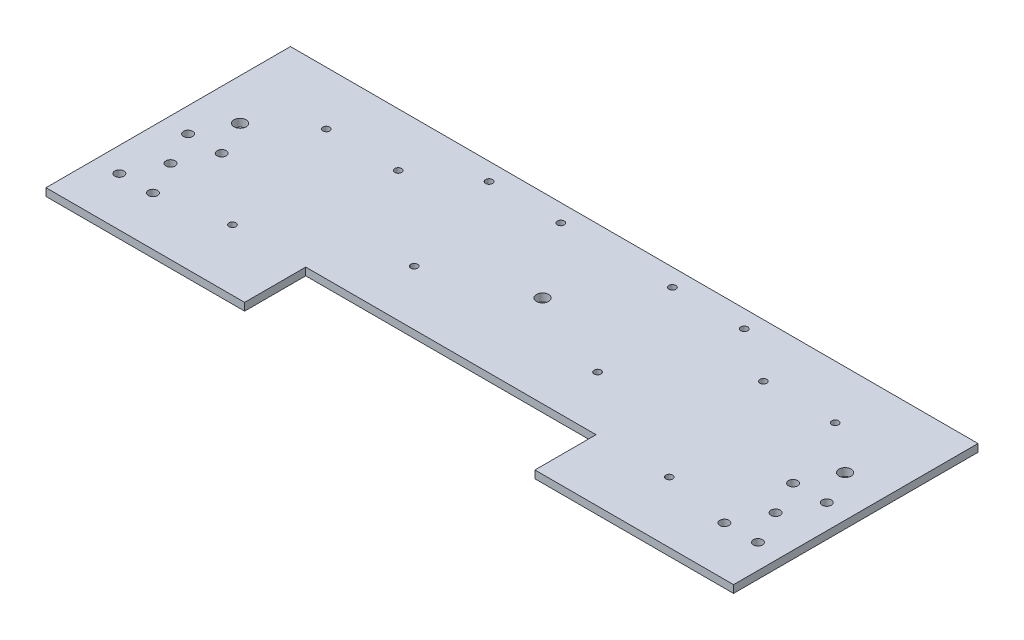
ISO-10303-21;
HEADER;
FILE_DESCRIPTION(('STEP AP214'),'2;1');
FILE_NAME('part.step','',(''),(''),'','','');
FILE_SCHEMA(('AUTOMOTIVE_DESIGN { 1 0 10303 214 1 1 1 1 }'));
ENDSEC;
DATA;
#1=APPLICATION_CONTEXT('core data for automotive mechanical design processes');
#2=APPLICATION_PROTOCOL_DEFINITION('international standard','automotive_design',2000,#1);
#3=PRODUCT_CONTEXT('',#1,'mechanical');
#4=PRODUCT('Part','Part','',(#3));
#5=PRODUCT_RELATED_PRODUCT_CATEGORY('part','',(#4));
#6=PRODUCT_DEFINITION_FORMATION('','',#4);
#7=PRODUCT_DEFINITION_CONTEXT('part definition',#1,'design');
#8=PRODUCT_DEFINITION('design','',#6,#7);
#9=PRODUCT_DEFINITION_SHAPE('','',#8);
#10=(LENGTH_UNIT() NAMED_UNIT(*) SI_UNIT(.MILLI.,.METRE.));
#11=(NAMED_UNIT(*) PLANE_ANGLE_UNIT() SI_UNIT($,.RADIAN.));
#12=(NAMED_UNIT(*) SI_UNIT($,.STERADIAN.) SOLID_ANGLE_UNIT());
#13=UNCERTAINTY_MEASURE_WITH_UNIT(LENGTH_MEASURE(1.E-05),#10,'distance_accuracy_value','');
#14=(GEOMETRIC_REPRESENTATION_CONTEXT(3) GLOBAL_UNCERTAINTY_ASSIGNED_CONTEXT((#13)) GLOBAL_UNIT_ASSIGNED_CONTEXT((#10,
#11,#12)) REPRESENTATION_CONTEXT('',''));
#15=CARTESIAN_POINT('',(0.,0.,0.));
#16=DIRECTION('',(0.,0.,1.));
#17=DIRECTION('',(1.,0.,0.));
#18=AXIS2_PLACEMENT_3D('',#15,#16,#17);
#19=CARTESIAN_POINT('',(0.,5.,0.));
#20=DIRECTION('',(0.,0.,-1.));
#21=DIRECTION('',(-1.,0.,0.));
#22=AXIS2_PLACEMENT_3D('',#19,#20,#21);
#23=PLANE('',#22);
#24=DIRECTION('',(1.,0.,0.));
#25=VECTOR('',#24,1.);
#26=CARTESIAN_POINT('',(0.,0.,0.));
#27=LINE('',#26,#25);
#28=CARTESIAN_POINT('',(130.,0.,0.));
#29=VERTEX_POINT('',#28);
#30=CARTESIAN_POINT('',(320.,0.,0.));
#31=VERTEX_POINT('',#30);
#32=EDGE_CURVE('E56',#29,#31,#27,.T.);
#33=ORIENTED_EDGE('',*,*,#32,.T.);
#34=DIRECTION('',(0.,1.,0.));
#35=VECTOR('',#34,1.);
#36=CARTESIAN_POINT('',(320.,0.,0.));
#37=LINE('',#36,#35);
#38=CARTESIAN_POINT('',(320.,5.,0.));
#39=VERTEX_POINT('',#38);
#40=EDGE_CURVE('E51',#31,#39,#37,.T.);
#41=ORIENTED_EDGE('',*,*,#40,.T.);
#42=DIRECTION('',(1.,0.,0.));
#43=VECTOR('',#42,1.);
#44=CARTESIAN_POINT('',(0.,5.,0.));
#45=LINE('',#44,#43);
#46=CARTESIAN_POINT('',(130.,5.,0.));
#47=VERTEX_POINT('',#46);
#48=EDGE_CURVE('E151',#47,#39,#45,.T.);
#49=ORIENTED_EDGE('',*,*,#48,.F.);
#50=DIRECTION('',(0.,1.,0.));
#51=VECTOR('',#50,1.);
#52=CARTESIAN_POINT('',(130.,0.,0.));
#53=LINE('',#52,#51);
#54=EDGE_CURVE('E146',#29,#47,#53,.T.);
#55=ORIENTED_EDGE('',*,*,#54,.F.);
#56=EDGE_LOOP('',(#33,#41,#49,#55));
#57=FACE_BOUND('',#56,.T.);
#58=ADVANCED_FACE('F34',(#57),#23,.F.);
#59=CARTESIAN_POINT('',(0.,5.,0.));
#60=DIRECTION('',(1.,0.,0.));
#61=DIRECTION('',(0.,0.,-1.));
#62=AXIS2_PLACEMENT_3D('',#59,#60,#61);
#63=PLANE('',#62);
#64=DIRECTION('',(0.,0.,1.));
#65=VECTOR('',#64,1.);
#66=CARTESIAN_POINT('',(0.,0.,0.));
#67=LINE('',#66,#65);
#68=CARTESIAN_POINT('',(0.,0.,-120.));
#69=VERTEX_POINT('',#68);
#70=CARTESIAN_POINT('',(0.,0.,40.));
#71=VERTEX_POINT('',#70);
#72=EDGE_CURVE('E313',#69,#71,#67,.T.);
#73=ORIENTED_EDGE('',*,*,#72,.T.);
#74=DIRECTION('',(0.,1.,0.));
#75=VECTOR('',#74,1.);
#76=CARTESIAN_POINT('',(0.,0.,40.));
#77=LINE('',#76,#75);
#78=CARTESIAN_POINT('',(0.,5.,40.));
#79=VERTEX_POINT('',#78);
#80=EDGE_CURVE('E160',#71,#79,#77,.T.);
#81=ORIENTED_EDGE('',*,*,#80,.T.);
#82=DIRECTION('',(0.,0.,1.));
#83=VECTOR('',#82,1.);
#84=CARTESIAN_POINT('',(0.,5.,0.));
#85=LINE('',#84,#83);
#86=CARTESIAN_POINT('',(0.,5.,-120.));
#87=VERTEX_POINT('',#86);
#88=EDGE_CURVE('E302',#87,#79,#85,.T.);
#89=ORIENTED_EDGE('',*,*,#88,.F.);
#90=DIRECTION('',(0.,-1.,0.));
#91=VECTOR('',#90,1.);
#92=CARTESIAN_POINT('',(0.,5.,-120.));
#93=LINE('',#92,#91);
#94=EDGE_CURVE('E43',#87,#69,#93,.T.);
#95=ORIENTED_EDGE('',*,*,#94,.T.);
#96=EDGE_LOOP('',(#73,#81,#89,#95));
#97=FACE_BOUND('',#96,.T.);
#98=ADVANCED_FACE('F36',(#97),#63,.F.);
#99=CARTESIAN_POINT('',(450.,5.,0.));
#100=DIRECTION('',(-1.,0.,0.));
#101=DIRECTION('',(0.,0.,1.));
#102=AXIS2_PLACEMENT_3D('',#99,#100,#101);
#103=PLANE('',#102);
#104=DIRECTION('',(0.,0.,-1.));
#105=VECTOR('',#104,1.);
#106=CARTESIAN_POINT('',(450.,0.,0.));
#107=LINE('',#106,#105);
#108=CARTESIAN_POINT('',(450.,0.,40.));
#109=VERTEX_POINT('',#108);
#110=CARTESIAN_POINT('',(450.,0.,-120.));
#111=VERTEX_POINT('',#110);
#112=EDGE_CURVE('E118',#109,#111,#107,.T.);
#113=ORIENTED_EDGE('',*,*,#112,.T.);
#114=DIRECTION('',(0.,-1.,0.));
#115=VECTOR('',#114,1.);
#116=CARTESIAN_POINT('',(450.,5.,-120.));
#117=LINE('',#116,#115);
#118=CARTESIAN_POINT('',(450.,5.,-120.));
#119=VERTEX_POINT('',#118);
#120=EDGE_CURVE('E11',#119,#111,#117,.T.);
#121=ORIENTED_EDGE('',*,*,#120,.F.);
#122=DIRECTION('',(0.,0.,-1.));
#123=VECTOR('',#122,1.);
#124=CARTESIAN_POINT('',(450.,5.,0.));
#125=LINE('',#124,#123);
#126=CARTESIAN_POINT('',(450.,5.,40.));
#127=VERTEX_POINT('',#126);
#128=EDGE_CURVE('E321',#127,#119,#125,.T.);
#129=ORIENTED_EDGE('',*,*,#128,.F.);
#130=DIRECTION('',(0.,1.,0.));
#131=VECTOR('',#130,1.);
#132=CARTESIAN_POINT('',(450.,0.,40.));
#133=LINE('',#132,#131);
#134=EDGE_CURVE('E110',#109,#127,#133,.T.);
#135=ORIENTED_EDGE('',*,*,#134,.F.);
#136=EDGE_LOOP('',(#113,#121,#129,#135));
#137=FACE_BOUND('',#136,.T.);
#138=ADVANCED_FACE('F335',(#137),#103,.F.);
#139=CARTESIAN_POINT('',(0.,5.,-120.));
#140=DIRECTION('',(0.,0.,1.));
#141=DIRECTION('',(1.,0.,0.));
#142=AXIS2_PLACEMENT_3D('',#139,#140,#141);
#143=PLANE('',#142);
#144=DIRECTION('',(-1.,0.,0.));
#145=VECTOR('',#144,1.);
#146=CARTESIAN_POINT('',(0.,0.,-120.));
#147=LINE('',#146,#145);
#148=EDGE_CURVE('E310',#111,#69,#147,.T.);
#149=ORIENTED_EDGE('',*,*,#148,.T.);
#150=ORIENTED_EDGE('',*,*,#94,.F.);
#151=DIRECTION('',(-1.,0.,0.));
#152=VECTOR('',#151,1.);
#153=CARTESIAN_POINT('',(0.,5.,-120.));
#154=LINE('',#153,#152);
#155=EDGE_CURVE('E306',#119,#87,#154,.T.);
#156=ORIENTED_EDGE('',*,*,#155,.F.);
#157=ORIENTED_EDGE('',*,*,#120,.T.);
#158=EDGE_LOOP('',(#149,#150,#156,#157));
#159=FACE_BOUND('',#158,.T.);
#160=ADVANCED_FACE('F260',(#159),#143,.F.);
#161=CARTESIAN_POINT('',(0.,5.,0.));
#162=DIRECTION('',(0.,-1.,0.));
#163=DIRECTION('',(0.,0.,-1.));
#164=AXIS2_PLACEMENT_3D('',#161,#162,#163);
#165=PLANE('',#164);
#166=CARTESIAN_POINT('',(412.,5.,8.));
#167=DIRECTION('',(0.,1.,0.));
#168=DIRECTION('',(0.,0.,1.));
#169=AXIS2_PLACEMENT_3D('',#166,#167,#168);
#170=CIRCLE('',#169,2.99999999999999);
#171=CARTESIAN_POINT('',(412.,5.,11.));
#172=VERTEX_POINT('',#171);
#173=EDGE_CURVE('E228',#172,#172,#170,.T.);
#174=ORIENTED_EDGE('',*,*,#173,.F.);
#175=EDGE_LOOP('',(#174));
#176=FACE_BOUND('',#175,.T.);
#177=CARTESIAN_POINT('',(423.,5.,-14.5));
#178=DIRECTION('',(0.,1.,0.));
#179=DIRECTION('',(0.,0.,-1.));
#180=AXIS2_PLACEMENT_3D('',#177,#178,#179);
#181=CIRCLE('',#180,2.99999999999999);
#182=CARTESIAN_POINT('',(423.,5.,-17.5));
#183=VERTEX_POINT('',#182);
#184=EDGE_CURVE('E218',#183,#183,#181,.T.);
#185=ORIENTED_EDGE('',*,*,#184,.F.);
#186=EDGE_LOOP('',(#185));
#187=FACE_BOUND('',#186,.T.);
#188=CARTESIAN_POINT('',(434.,5.,8.));
#189=DIRECTION('',(0.,1.,0.));
#190=DIRECTION('',(0.,0.,-1.));
#191=AXIS2_PLACEMENT_3D('',#188,#189,#190);
#192=CIRCLE('',#191,2.99999999999999);
#193=CARTESIAN_POINT('',(434.,5.,5.));
#194=VERTEX_POINT('',#193);
#195=EDGE_CURVE('E215',#194,#194,#192,.T.);
#196=ORIENTED_EDGE('',*,*,#195,.F.);
#197=EDGE_LOOP('',(#196));
#198=FACE_BOUND('',#197,.T.);
#199=CARTESIAN_POINT('',(434.,5.,-37.));
#200=DIRECTION('',(0.,1.,0.));
#201=DIRECTION('',(0.,0.,1.));
#202=AXIS2_PLACEMENT_3D('',#199,#200,#201);
#203=CIRCLE('',#202,2.99999999999999);
#204=CARTESIAN_POINT('',(434.,5.,-34.));
#205=VERTEX_POINT('',#204);
#206=EDGE_CURVE('E212',#205,#205,#203,.T.);
#207=ORIENTED_EDGE('',*,*,#206,.F.);
#208=EDGE_LOOP('',(#207));
#209=FACE_BOUND('',#208,.T.);
#210=CARTESIAN_POINT('',(412.,5.,-37.));
#211=DIRECTION('',(0.,1.,0.));
#212=DIRECTION('',(0.,0.,-1.));
#213=AXIS2_PLACEMENT_3D('',#210,#211,#212);
#214=CIRCLE('',#213,2.99999999999999);
#215=CARTESIAN_POINT('',(412.,5.,-40.));
#216=VERTEX_POINT('',#215);
#217=EDGE_CURVE('E208',#216,#216,#214,.T.);
#218=ORIENTED_EDGE('',*,*,#217,.F.);
#219=EDGE_LOOP('',(#218));
#220=FACE_BOUND('',#219,.T.);
#221=CARTESIAN_POINT('',(27.,5.,-14.5));
#222=DIRECTION('',(0.,1.,0.));
#223=DIRECTION('',(0.,0.,1.));
#224=AXIS2_PLACEMENT_3D('',#221,#222,#223);
#225=CIRCLE('',#224,3.00000000000001);
#226=CARTESIAN_POINT('',(27.,5.,-11.5));
#227=VERTEX_POINT('',#226);
#228=EDGE_CURVE('E204',#227,#227,#225,.T.);
#229=ORIENTED_EDGE('',*,*,#228,.F.);
#230=EDGE_LOOP('',(#229));
#231=FACE_BOUND('',#230,.T.);
#232=CARTESIAN_POINT('',(38.,5.,8.));
#233=DIRECTION('',(0.,1.,0.));
#234=DIRECTION('',(0.,0.,-1.));
#235=AXIS2_PLACEMENT_3D('',#232,#233,#234);
#236=CIRCLE('',#235,3.00000000000001);
#237=CARTESIAN_POINT('',(38.,5.,4.99999999999999));
#238=VERTEX_POINT('',#237);
#239=EDGE_CURVE('E200',#238,#238,#236,.T.);
#240=ORIENTED_EDGE('',*,*,#239,.F.);
#241=EDGE_LOOP('',(#240));
#242=FACE_BOUND('',#241,.T.);
#243=CARTESIAN_POINT('',(16.,5.,8.));
#244=DIRECTION('',(0.,1.,0.));
#245=DIRECTION('',(0.,0.,1.));
#246=AXIS2_PLACEMENT_3D('',#243,#244,#245);
#247=CIRCLE('',#246,3.00000000000001);
#248=CARTESIAN_POINT('',(16.,5.,11.));
#249=VERTEX_POINT('',#248);
#250=EDGE_CURVE('E196',#249,#249,#247,.T.);
#251=ORIENTED_EDGE('',*,*,#250,.F.);
#252=EDGE_LOOP('',(#251));
#253=FACE_BOUND('',#252,.T.);
#254=CARTESIAN_POINT('',(16.,5.,-37.));
#255=DIRECTION('',(0.,1.,0.));
#256=DIRECTION('',(0.,0.,-1.));
#257=AXIS2_PLACEMENT_3D('',#254,#255,#256);
#258=CIRCLE('',#257,3.00000000000001);
#259=CARTESIAN_POINT('',(16.,5.,-40.));
#260=VERTEX_POINT('',#259);
#261=EDGE_CURVE('E192',#260,#260,#258,.T.);
#262=ORIENTED_EDGE('',*,*,#261,.F.);
#263=EDGE_LOOP('',(#262));
#264=FACE_BOUND('',#263,.T.);
#265=CARTESIAN_POINT('',(38.,5.,-37.));
#266=DIRECTION('',(0.,1.,0.));
#267=DIRECTION('',(0.,0.,1.));
#268=AXIS2_PLACEMENT_3D('',#265,#266,#267);
#269=CIRCLE('',#268,3.00000000000001);
#270=CARTESIAN_POINT('',(38.,5.,-34.));
#271=VERTEX_POINT('',#270);
#272=EDGE_CURVE('E188',#271,#271,#269,.T.);
#273=ORIENTED_EDGE('',*,*,#272,.F.);
#274=EDGE_LOOP('',(#273));
#275=FACE_BOUND('',#274,.T.);
#276=CARTESIAN_POINT('',(391.5,5.,-85.));
#277=DIRECTION('',(0.,1.,0.));
#278=DIRECTION('',(0.,0.,-1.));
#279=AXIS2_PLACEMENT_3D('',#276,#277,#278);
#280=CIRCLE('',#279,2.25000000000001);
#281=CARTESIAN_POINT('',(391.5,5.,-87.2500000000001));
#282=VERTEX_POINT('',#281);
#283=EDGE_CURVE('E184',#282,#282,#280,.T.);
#284=ORIENTED_EDGE('',*,*,#283,.F.);
#285=EDGE_LOOP('',(#284));
#286=FACE_BOUND('',#285,.T.);
#287=CARTESIAN_POINT('',(344.5,5.,-85.));
#288=DIRECTION('',(0.,1.,0.));
#289=DIRECTION('',(0.,0.,1.));
#290=AXIS2_PLACEMENT_3D('',#287,#288,#289);
#291=CIRCLE('',#290,2.25000000000001);
#292=CARTESIAN_POINT('',(344.5,5.,-82.75));
#293=VERTEX_POINT('',#292);
#294=EDGE_CURVE('E180',#293,#293,#291,.T.);
#295=ORIENTED_EDGE('',*,*,#294,.F.);
#296=EDGE_LOOP('',(#295));
#297=FACE_BOUND('',#296,.T.);
#298=CARTESIAN_POINT('',(368.,5.,0.));
#299=DIRECTION('',(0.,1.,0.));
#300=DIRECTION('',(0.,0.,-1.));
#301=AXIS2_PLACEMENT_3D('',#298,#299,#300);
#302=CIRCLE('',#301,2.24999999999995);
#303=CARTESIAN_POINT('',(368.,5.,-2.24999999999998));
#304=VERTEX_POINT('',#303);
#305=EDGE_CURVE('E176',#304,#304,#302,.T.);
#306=ORIENTED_EDGE('',*,*,#305,.F.);
#307=EDGE_LOOP('',(#306));
#308=FACE_BOUND('',#307,.T.);
#309=CARTESIAN_POINT('',(105.5,5.,-85.));
#310=DIRECTION('',(0.,1.,0.));
#311=DIRECTION('',(0.,0.,-1.));
#312=AXIS2_PLACEMENT_3D('',#309,#310,#311);
#313=CIRCLE('',#312,2.25000000000001);
#314=CARTESIAN_POINT('',(105.5,5.,-87.25));
#315=VERTEX_POINT('',#314);
#316=EDGE_CURVE('E172',#315,#315,#313,.T.);
#317=ORIENTED_EDGE('',*,*,#316,.F.);
#318=EDGE_LOOP('',(#317));
#319=FACE_BOUND('',#318,.T.);
#320=CARTESIAN_POINT('',(58.5,5.,-85.));
#321=DIRECTION('',(0.,1.,0.));
#322=DIRECTION('',(0.,0.,1.));
#323=AXIS2_PLACEMENT_3D('',#320,#321,#322);
#324=CIRCLE('',#323,2.25);
#325=CARTESIAN_POINT('',(58.5,5.,-82.75));
#326=VERTEX_POINT('',#325);
#327=EDGE_CURVE('E168',#326,#326,#324,.T.);
#328=ORIENTED_EDGE('',*,*,#327,.F.);
#329=EDGE_LOOP('',(#328));
#330=FACE_BOUND('',#329,.T.);
#331=CARTESIAN_POINT('',(82.,5.,0.));
#332=DIRECTION('',(0.,1.,0.));
#333=DIRECTION('',(0.,0.,1.));
#334=AXIS2_PLACEMENT_3D('',#331,#332,#333);
#335=CIRCLE('',#334,2.25);
#336=CARTESIAN_POINT('',(82.,5.,2.25));
#337=VERTEX_POINT('',#336);
#338=EDGE_CURVE('E126',#337,#337,#335,.T.);
#339=ORIENTED_EDGE('',*,*,#338,.F.);
#340=EDGE_LOOP('',(#339));
#341=FACE_BOUND('',#340,.T.);
#342=CARTESIAN_POINT('',(308.5,5.,-108.5));
#343=DIRECTION('',(0.,1.,0.));
#344=DIRECTION('',(0.,0.,-1.));
#345=AXIS2_PLACEMENT_3D('',#342,#343,#344);
#346=CIRCLE('',#345,2.25000000000001);
#347=CARTESIAN_POINT('',(308.5,5.,-110.75));
#348=VERTEX_POINT('',#347);
#349=EDGE_CURVE('E150',#348,#348,#346,.T.);
#350=ORIENTED_EDGE('',*,*,#349,.F.);
#351=EDGE_LOOP('',(#350));
#352=FACE_BOUND('',#351,.T.);
#353=CARTESIAN_POINT('',(261.5,5.,-108.5));
#354=DIRECTION('',(0.,1.,0.));
#355=DIRECTION('',(0.,0.,1.));
#356=AXIS2_PLACEMENT_3D('',#353,#354,#355);
#357=CIRCLE('',#356,2.25000000000001);
#358=CARTESIAN_POINT('',(261.5,5.,-106.25));
#359=VERTEX_POINT('',#358);
#360=EDGE_CURVE('E272',#359,#359,#357,.T.);
#361=ORIENTED_EDGE('',*,*,#360,.F.);
#362=EDGE_LOOP('',(#361));
#363=FACE_BOUND('',#362,.T.);
#364=CARTESIAN_POINT('',(285.,5.,-36.));
#365=DIRECTION('',(0.,1.,0.));
#366=DIRECTION('',(0.,0.,-1.));
#367=AXIS2_PLACEMENT_3D('',#364,#365,#366);
#368=CIRCLE('',#367,2.25000000000001);
#369=CARTESIAN_POINT('',(285.,5.,-38.25));
#370=VERTEX_POINT('',#369);
#371=EDGE_CURVE('E276',#370,#370,#368,.T.);
#372=ORIENTED_EDGE('',*,*,#371,.F.);
#373=EDGE_LOOP('',(#372));
#374=FACE_BOUND('',#373,.T.);
#375=CARTESIAN_POINT('',(188.5,5.,-108.5));
#376=DIRECTION('',(0.,1.,0.));
#377=DIRECTION('',(0.,0.,-1.));
#378=AXIS2_PLACEMENT_3D('',#375,#376,#377);
#379=CIRCLE('',#378,2.25000000000001);
#380=CARTESIAN_POINT('',(188.5,5.,-110.75));
#381=VERTEX_POINT('',#380);
#382=EDGE_CURVE('E280',#381,#381,#379,.T.);
#383=ORIENTED_EDGE('',*,*,#382,.F.);
#384=EDGE_LOOP('',(#383));
#385=FACE_BOUND('',#384,.T.);
#386=CARTESIAN_POINT('',(141.5,5.,-108.5));
#387=DIRECTION('',(0.,1.,0.));
#388=DIRECTION('',(0.,0.,1.));
#389=AXIS2_PLACEMENT_3D('',#386,#387,#388);
#390=CIRCLE('',#389,2.25000000000001);
#391=CARTESIAN_POINT('',(141.5,5.,-106.25));
#392=VERTEX_POINT('',#391);
#393=EDGE_CURVE('E284',#392,#392,#390,.T.);
#394=ORIENTED_EDGE('',*,*,#393,.F.);
#395=EDGE_LOOP('',(#394));
#396=FACE_BOUND('',#395,.T.);
#397=CARTESIAN_POINT('',(165.,5.,-36.));
#398=DIRECTION('',(0.,1.,0.));
#399=DIRECTION('',(0.,0.,1.));
#400=AXIS2_PLACEMENT_3D('',#397,#398,#399);
#401=CIRCLE('',#400,2.25000000000001);
#402=CARTESIAN_POINT('',(165.,5.,-33.75));
#403=VERTEX_POINT('',#402);
#404=EDGE_CURVE('E288',#403,#403,#401,.T.);
#405=ORIENTED_EDGE('',*,*,#404,.F.);
#406=EDGE_LOOP('',(#405));
#407=FACE_BOUND('',#406,.T.);
#408=CARTESIAN_POINT('',(423.,5.,-60.));
#409=DIRECTION('',(0.,1.,0.));
#410=DIRECTION('',(0.,0.,-1.));
#411=AXIS2_PLACEMENT_3D('',#408,#409,#410);
#412=CIRCLE('',#411,3.99999999999999);
#413=CARTESIAN_POINT('',(423.,5.,-64.));
#414=VERTEX_POINT('',#413);
#415=EDGE_CURVE('E292',#414,#414,#412,.T.);
#416=ORIENTED_EDGE('',*,*,#415,.F.);
#417=EDGE_LOOP('',(#416));
#418=FACE_BOUND('',#417,.T.);
#419=CARTESIAN_POINT('',(27.,5.,-60.));
#420=DIRECTION('',(0.,1.,0.));
#421=DIRECTION('',(0.,0.,1.));
#422=AXIS2_PLACEMENT_3D('',#419,#420,#421);
#423=CIRCLE('',#422,4.00000000000001);
#424=CARTESIAN_POINT('',(27.,5.,-56.));
#425=VERTEX_POINT('',#424);
#426=EDGE_CURVE('E296',#425,#425,#423,.T.);
#427=ORIENTED_EDGE('',*,*,#426,.F.);
#428=EDGE_LOOP('',(#427));
#429=FACE_BOUND('',#428,.T.);
#430=CARTESIAN_POINT('',(225.,5.,-60.));
#431=DIRECTION('',(0.,1.,0.));
#432=DIRECTION('',(0.,0.,1.));
#433=AXIS2_PLACEMENT_3D('',#430,#431,#432);
#434=CIRCLE('',#433,3.99999999999999);
#435=CARTESIAN_POINT('',(225.,5.,-56.));
#436=VERTEX_POINT('',#435);
#437=EDGE_CURVE('E300',#436,#436,#434,.T.);
#438=ORIENTED_EDGE('',*,*,#437,.F.);
#439=EDGE_LOOP('',(#438));
#440=FACE_BOUND('',#439,.T.);
#441=ORIENTED_EDGE('',*,*,#88,.T.);
#442=DIRECTION('',(1.,0.,0.));
#443=VECTOR('',#442,1.);
#444=CARTESIAN_POINT('',(0.,5.,40.));
#445=LINE('',#444,#443);
#446=CARTESIAN_POINT('',(130.,5.,40.));
#447=VERTEX_POINT('',#446);
#448=EDGE_CURVE('E131',#79,#447,#445,.T.);
#449=ORIENTED_EDGE('',*,*,#448,.T.);
#450=DIRECTION('',(0.,0.,-1.));
#451=VECTOR('',#450,1.);
#452=CARTESIAN_POINT('',(130.,5.,0.));
#453=LINE('',#452,#451);
#454=EDGE_CURVE('E138',#447,#47,#453,.T.);
#455=ORIENTED_EDGE('',*,*,#454,.T.);
#456=ORIENTED_EDGE('',*,*,#48,.T.);
#457=DIRECTION('',(0.,0.,1.));
#458=VECTOR('',#457,1.);
#459=CARTESIAN_POINT('',(320.,5.,0.));
#460=LINE('',#459,#458);
#461=CARTESIAN_POINT('',(320.,5.,40.));
#462=VERTEX_POINT('',#461);
#463=EDGE_CURVE('E123',#39,#462,#460,.T.);
#464=ORIENTED_EDGE('',*,*,#463,.T.);
#465=DIRECTION('',(1.,0.,0.));
#466=VECTOR('',#465,1.);
#467=CARTESIAN_POINT('',(450.,5.,40.));
#468=LINE('',#467,#466);
#469=EDGE_CURVE('E105',#462,#127,#468,.T.);
#470=ORIENTED_EDGE('',*,*,#469,.T.);
#471=ORIENTED_EDGE('',*,*,#128,.T.);
#472=ORIENTED_EDGE('',*,*,#155,.T.);
#473=EDGE_LOOP('',(#441,#449,#455,#456,#464,#470,#471,#472));
#474=FACE_BOUND('',#473,.T.);
#475=ADVANCED_FACE('F257',(#176,#187,#198,#209,#220,#231,#242,#253,#264,#275,#286,#297,#308,
#319,#330,#341,#352,#363,#374,#385,#396,#407,#418,#429,#440,#474),#165,.F.);
#476=CARTESIAN_POINT('',(0.,0.,0.));
#477=DIRECTION('',(0.,-1.,0.));
#478=DIRECTION('',(0.,0.,-1.));
#479=AXIS2_PLACEMENT_3D('',#476,#477,#478);
#480=PLANE('',#479);
#481=CARTESIAN_POINT('',(412.,0.,8.));
#482=DIRECTION('',(0.,-1.,0.));
#483=DIRECTION('',(0.,0.,-1.));
#484=AXIS2_PLACEMENT_3D('',#481,#482,#483);
#485=CIRCLE('',#484,2.99999999999999);
#486=CARTESIAN_POINT('',(412.,0.,5.00000000000001));
#487=VERTEX_POINT('',#486);
#488=EDGE_CURVE('E38',#487,#487,#485,.T.);
#489=ORIENTED_EDGE('',*,*,#488,.F.);
#490=EDGE_LOOP('',(#489));
#491=FACE_BOUND('',#490,.T.);
#492=CARTESIAN_POINT('',(423.,0.,-14.5));
#493=DIRECTION('',(0.,-1.,0.));
#494=DIRECTION('',(0.,0.,-1.));
#495=AXIS2_PLACEMENT_3D('',#492,#493,#494);
#496=CIRCLE('',#495,2.99999999999999);
#497=CARTESIAN_POINT('',(423.,0.,-17.5));
#498=VERTEX_POINT('',#497);
#499=EDGE_CURVE('E216',#498,#498,#496,.T.);
#500=ORIENTED_EDGE('',*,*,#499,.F.);
#501=EDGE_LOOP('',(#500));
#502=FACE_BOUND('',#501,.T.);
#503=CARTESIAN_POINT('',(434.,0.,8.));
#504=DIRECTION('',(0.,-1.,0.));
#505=DIRECTION('',(0.,0.,-1.));
#506=AXIS2_PLACEMENT_3D('',#503,#504,#505);
#507=CIRCLE('',#506,2.99999999999999);
#508=CARTESIAN_POINT('',(434.,0.,5.));
#509=VERTEX_POINT('',#508);
#510=EDGE_CURVE('E213',#509,#509,#507,.T.);
#511=ORIENTED_EDGE('',*,*,#510,.F.);
#512=EDGE_LOOP('',(#511));
#513=FACE_BOUND('',#512,.T.);
#514=CARTESIAN_POINT('',(434.,0.,-37.));
#515=DIRECTION('',(0.,-1.,0.));
#516=DIRECTION('',(0.,0.,-1.));
#517=AXIS2_PLACEMENT_3D('',#514,#515,#516);
#518=CIRCLE('',#517,2.99999999999999);
#519=CARTESIAN_POINT('',(434.,0.,-40.));
#520=VERTEX_POINT('',#519);
#521=EDGE_CURVE('E209',#520,#520,#518,.T.);
#522=ORIENTED_EDGE('',*,*,#521,.F.);
#523=EDGE_LOOP('',(#522));
#524=FACE_BOUND('',#523,.T.);
#525=CARTESIAN_POINT('',(412.,0.,-37.));
#526=DIRECTION('',(0.,-1.,0.));
#527=DIRECTION('',(0.,0.,-1.));
#528=AXIS2_PLACEMENT_3D('',#525,#526,#527);
#529=CIRCLE('',#528,2.99999999999999);
#530=CARTESIAN_POINT('',(412.,0.,-40.));
#531=VERTEX_POINT('',#530);
#532=EDGE_CURVE('E205',#531,#531,#529,.T.);
#533=ORIENTED_EDGE('',*,*,#532,.F.);
#534=EDGE_LOOP('',(#533));
#535=FACE_BOUND('',#534,.T.);
#536=CARTESIAN_POINT('',(27.,0.,-14.5));
#537=DIRECTION('',(0.,-1.,0.));
#538=DIRECTION('',(0.,0.,-1.));
#539=AXIS2_PLACEMENT_3D('',#536,#537,#538);
#540=CIRCLE('',#539,3.00000000000001);
#541=CARTESIAN_POINT('',(27.,0.,-17.5));
#542=VERTEX_POINT('',#541);
#543=EDGE_CURVE('E201',#542,#542,#540,.T.);
#544=ORIENTED_EDGE('',*,*,#543,.F.);
#545=EDGE_LOOP('',(#544));
#546=FACE_BOUND('',#545,.T.);
#547=CARTESIAN_POINT('',(38.,0.,8.));
#548=DIRECTION('',(0.,-1.,0.));
#549=DIRECTION('',(0.,0.,-1.));
#550=AXIS2_PLACEMENT_3D('',#547,#548,#549);
#551=CIRCLE('',#550,3.00000000000001);
#552=CARTESIAN_POINT('',(38.,0.,4.99999999999999));
#553=VERTEX_POINT('',#552);
#554=EDGE_CURVE('E197',#553,#553,#551,.T.);
#555=ORIENTED_EDGE('',*,*,#554,.F.);
#556=EDGE_LOOP('',(#555));
#557=FACE_BOUND('',#556,.T.);
#558=CARTESIAN_POINT('',(16.,0.,8.));
#559=DIRECTION('',(0.,-1.,0.));
#560=DIRECTION('',(0.,0.,-1.));
#561=AXIS2_PLACEMENT_3D('',#558,#559,#560);
#562=CIRCLE('',#561,3.00000000000001);
#563=CARTESIAN_POINT('',(16.,0.,4.99999999999999));
#564=VERTEX_POINT('',#563);
#565=EDGE_CURVE('E193',#564,#564,#562,.T.);
#566=ORIENTED_EDGE('',*,*,#565,.F.);
#567=EDGE_LOOP('',(#566));
#568=FACE_BOUND('',#567,.T.);
#569=CARTESIAN_POINT('',(16.,0.,-37.));
#570=DIRECTION('',(0.,-1.,0.));
#571=DIRECTION('',(0.,0.,-1.));
#572=AXIS2_PLACEMENT_3D('',#569,#570,#571);
#573=CIRCLE('',#572,3.00000000000001);
#574=CARTESIAN_POINT('',(16.,0.,-40.));
#575=VERTEX_POINT('',#574);
#576=EDGE_CURVE('E189',#575,#575,#573,.T.);
#577=ORIENTED_EDGE('',*,*,#576,.F.);
#578=EDGE_LOOP('',(#577));
#579=FACE_BOUND('',#578,.T.);
#580=CARTESIAN_POINT('',(38.,0.,-37.));
#581=DIRECTION('',(0.,-1.,0.));
#582=DIRECTION('',(0.,0.,-1.));
#583=AXIS2_PLACEMENT_3D('',#580,#581,#582);
#584=CIRCLE('',#583,3.00000000000001);
#585=CARTESIAN_POINT('',(38.,0.,-40.));
#586=VERTEX_POINT('',#585);
#587=EDGE_CURVE('E185',#586,#586,#584,.T.);
#588=ORIENTED_EDGE('',*,*,#587,.F.);
#589=EDGE_LOOP('',(#588));
#590=FACE_BOUND('',#589,.T.);
#591=CARTESIAN_POINT('',(391.5,0.,-85.));
#592=DIRECTION('',(0.,-1.,0.));
#593=DIRECTION('',(0.,0.,-1.));
#594=AXIS2_PLACEMENT_3D('',#591,#592,#593);
#595=CIRCLE('',#594,2.25000000000001);
#596=CARTESIAN_POINT('',(391.5,0.,-87.2500000000001));
#597=VERTEX_POINT('',#596);
#598=EDGE_CURVE('E181',#597,#597,#595,.T.);
#599=ORIENTED_EDGE('',*,*,#598,.F.);
#600=EDGE_LOOP('',(#599));
#601=FACE_BOUND('',#600,.T.);
#602=CARTESIAN_POINT('',(344.5,0.,-85.));
#603=DIRECTION('',(0.,-1.,0.));
#604=DIRECTION('',(0.,0.,-1.));
#605=AXIS2_PLACEMENT_3D('',#602,#603,#604);
#606=CIRCLE('',#605,2.25000000000001);
#607=CARTESIAN_POINT('',(344.5,0.,-87.2500000000001));
#608=VERTEX_POINT('',#607);
#609=EDGE_CURVE('E177',#608,#608,#606,.T.);
#610=ORIENTED_EDGE('',*,*,#609,.F.);
#611=EDGE_LOOP('',(#610));
#612=FACE_BOUND('',#611,.T.);
#613=CARTESIAN_POINT('',(368.,0.,0.));
#614=DIRECTION('',(0.,-1.,0.));
#615=DIRECTION('',(0.,0.,-1.));
#616=AXIS2_PLACEMENT_3D('',#613,#614,#615);
#617=CIRCLE('',#616,2.24999999999995);
#618=CARTESIAN_POINT('',(368.,0.,-2.24999999999998));
#619=VERTEX_POINT('',#618);
#620=EDGE_CURVE('E173',#619,#619,#617,.T.);
#621=ORIENTED_EDGE('',*,*,#620,.F.);
#622=EDGE_LOOP('',(#621));
#623=FACE_BOUND('',#622,.T.);
#624=CARTESIAN_POINT('',(105.5,0.,-85.));
#625=DIRECTION('',(0.,-1.,0.));
#626=DIRECTION('',(0.,0.,-1.));
#627=AXIS2_PLACEMENT_3D('',#624,#625,#626);
#628=CIRCLE('',#627,2.25000000000001);
#629=CARTESIAN_POINT('',(105.5,0.,-87.25));
#630=VERTEX_POINT('',#629);
#631=EDGE_CURVE('E169',#630,#630,#628,.T.);
#632=ORIENTED_EDGE('',*,*,#631,.F.);
#633=EDGE_LOOP('',(#632));
#634=FACE_BOUND('',#633,.T.);
#635=CARTESIAN_POINT('',(58.5,0.,-85.));
#636=DIRECTION('',(0.,-1.,0.));
#637=DIRECTION('',(0.,0.,-1.));
#638=AXIS2_PLACEMENT_3D('',#635,#636,#637);
#639=CIRCLE('',#638,2.25);
#640=CARTESIAN_POINT('',(58.5,0.,-87.25));
#641=VERTEX_POINT('',#640);
#642=EDGE_CURVE('E165',#641,#641,#639,.T.);
#643=ORIENTED_EDGE('',*,*,#642,.F.);
#644=EDGE_LOOP('',(#643));
#645=FACE_BOUND('',#644,.T.);
#646=CARTESIAN_POINT('',(82.,0.,0.));
#647=DIRECTION('',(0.,-1.,0.));
#648=DIRECTION('',(0.,0.,-1.));
#649=AXIS2_PLACEMENT_3D('',#646,#647,#648);
#650=CIRCLE('',#649,2.25);
#651=CARTESIAN_POINT('',(82.,0.,-2.24999999999999));
#652=VERTEX_POINT('',#651);
#653=EDGE_CURVE('E129',#652,#652,#650,.T.);
#654=ORIENTED_EDGE('',*,*,#653,.F.);
#655=EDGE_LOOP('',(#654));
#656=FACE_BOUND('',#655,.T.);
#657=CARTESIAN_POINT('',(308.5,0.,-108.5));
#658=DIRECTION('',(0.,1.,0.));
#659=DIRECTION('',(0.,0.,-1.));
#660=AXIS2_PLACEMENT_3D('',#657,#658,#659);
#661=CIRCLE('',#660,2.25000000000001);
#662=CARTESIAN_POINT('',(308.5,0.,-110.75));
#663=VERTEX_POINT('',#662);
#664=EDGE_CURVE('E630',#663,#663,#661,.T.);
#665=ORIENTED_EDGE('',*,*,#664,.T.);
#666=EDGE_LOOP('',(#665));
#667=FACE_BOUND('',#666,.T.);
#668=CARTESIAN_POINT('',(261.5,0.,-108.5));
#669=DIRECTION('',(0.,1.,0.));
#670=DIRECTION('',(0.,0.,1.));
#671=AXIS2_PLACEMENT_3D('',#668,#669,#670);
#672=CIRCLE('',#671,2.25000000000001);
#673=CARTESIAN_POINT('',(261.5,0.,-106.25));
#674=VERTEX_POINT('',#673);
#675=EDGE_CURVE('E626',#674,#674,#672,.T.);
#676=ORIENTED_EDGE('',*,*,#675,.T.);
#677=EDGE_LOOP('',(#676));
#678=FACE_BOUND('',#677,.T.);
#679=CARTESIAN_POINT('',(285.,0.,-36.));
#680=DIRECTION('',(0.,1.,0.));
#681=DIRECTION('',(0.,0.,-1.));
#682=AXIS2_PLACEMENT_3D('',#679,#680,#681);
#683=CIRCLE('',#682,2.25000000000001);
#684=CARTESIAN_POINT('',(285.,0.,-38.25));
#685=VERTEX_POINT('',#684);
#686=EDGE_CURVE('E622',#685,#685,#683,.T.);
#687=ORIENTED_EDGE('',*,*,#686,.T.);
#688=EDGE_LOOP('',(#687));
#689=FACE_BOUND('',#688,.T.);
#690=CARTESIAN_POINT('',(188.5,0.,-108.5));
#691=DIRECTION('',(0.,1.,0.));
#692=DIRECTION('',(0.,0.,-1.));
#693=AXIS2_PLACEMENT_3D('',#690,#691,#692);
#694=CIRCLE('',#693,2.25000000000001);
#695=CARTESIAN_POINT('',(188.5,0.,-110.75));
#696=VERTEX_POINT('',#695);
#697=EDGE_CURVE('E618',#696,#696,#694,.T.);
#698=ORIENTED_EDGE('',*,*,#697,.T.);
#699=EDGE_LOOP('',(#698));
#700=FACE_BOUND('',#699,.T.);
#701=CARTESIAN_POINT('',(141.5,0.,-108.5));
#702=DIRECTION('',(0.,1.,0.));
#703=DIRECTION('',(0.,0.,1.));
#704=AXIS2_PLACEMENT_3D('',#701,#702,#703);
#705=CIRCLE('',#704,2.25000000000001);
#706=CARTESIAN_POINT('',(141.5,0.,-106.25));
#707=VERTEX_POINT('',#706);
#708=EDGE_CURVE('E614',#707,#707,#705,.T.);
#709=ORIENTED_EDGE('',*,*,#708,.T.);
#710=EDGE_LOOP('',(#709));
#711=FACE_BOUND('',#710,.T.);
#712=CARTESIAN_POINT('',(165.,0.,-36.));
#713=DIRECTION('',(0.,1.,0.));
#714=DIRECTION('',(0.,0.,1.));
#715=AXIS2_PLACEMENT_3D('',#712,#713,#714);
#716=CIRCLE('',#715,2.25000000000001);
#717=CARTESIAN_POINT('',(165.,0.,-33.75));
#718=VERTEX_POINT('',#717);
#719=EDGE_CURVE('E610',#718,#718,#716,.T.);
#720=ORIENTED_EDGE('',*,*,#719,.T.);
#721=EDGE_LOOP('',(#720));
#722=FACE_BOUND('',#721,.T.);
#723=CARTESIAN_POINT('',(423.,0.,-60.));
#724=DIRECTION('',(0.,1.,0.));
#725=DIRECTION('',(0.,0.,-1.));
#726=AXIS2_PLACEMENT_3D('',#723,#724,#725);
#727=CIRCLE('',#726,3.99999999999999);
#728=CARTESIAN_POINT('',(423.,0.,-64.));
#729=VERTEX_POINT('',#728);
#730=EDGE_CURVE('E607',#729,#729,#727,.T.);
#731=ORIENTED_EDGE('',*,*,#730,.T.);
#732=EDGE_LOOP('',(#731));
#733=FACE_BOUND('',#732,.T.);
#734=CARTESIAN_POINT('',(27.,0.,-60.));
#735=DIRECTION('',(0.,1.,0.));
#736=DIRECTION('',(0.,0.,1.));
#737=AXIS2_PLACEMENT_3D('',#734,#735,#736);
#738=CIRCLE('',#737,4.00000000000001);
#739=CARTESIAN_POINT('',(27.,0.,-56.));
#740=VERTEX_POINT('',#739);
#741=EDGE_CURVE('E601',#740,#740,#738,.T.);
#742=ORIENTED_EDGE('',*,*,#741,.T.);
#743=EDGE_LOOP('',(#742));
#744=FACE_BOUND('',#743,.T.);
#745=CARTESIAN_POINT('',(225.,0.,-60.));
#746=DIRECTION('',(0.,1.,0.));
#747=DIRECTION('',(0.,0.,1.));
#748=AXIS2_PLACEMENT_3D('',#745,#746,#747);
#749=CIRCLE('',#748,3.99999999999999);
#750=CARTESIAN_POINT('',(225.,0.,-56.));
#751=VERTEX_POINT('',#750);
#752=EDGE_CURVE('E328',#751,#751,#749,.T.);
#753=ORIENTED_EDGE('',*,*,#752,.T.);
#754=EDGE_LOOP('',(#753));
#755=FACE_BOUND('',#754,.T.);
#756=ORIENTED_EDGE('',*,*,#72,.F.);
#757=ORIENTED_EDGE('',*,*,#148,.F.);
#758=ORIENTED_EDGE('',*,*,#112,.F.);
#759=DIRECTION('',(1.,0.,0.));
#760=VECTOR('',#759,1.);
#761=CARTESIAN_POINT('',(450.,0.,40.));
#762=LINE('',#761,#760);
#763=CARTESIAN_POINT('',(320.,0.,40.));
#764=VERTEX_POINT('',#763);
#765=EDGE_CURVE('E103',#764,#109,#762,.T.);
#766=ORIENTED_EDGE('',*,*,#765,.F.);
#767=DIRECTION('',(0.,0.,1.));
#768=VECTOR('',#767,1.);
#769=CARTESIAN_POINT('',(320.,0.,0.));
#770=LINE('',#769,#768);
#771=EDGE_CURVE('E116',#31,#764,#770,.T.);
#772=ORIENTED_EDGE('',*,*,#771,.F.);
#773=ORIENTED_EDGE('',*,*,#32,.F.);
#774=DIRECTION('',(0.,0.,-1.));
#775=VECTOR('',#774,1.);
#776=CARTESIAN_POINT('',(130.,0.,0.));
#777=LINE('',#776,#775);
#778=CARTESIAN_POINT('',(130.,0.,40.));
#779=VERTEX_POINT('',#778);
#780=EDGE_CURVE('E137',#779,#29,#777,.T.);
#781=ORIENTED_EDGE('',*,*,#780,.F.);
#782=DIRECTION('',(1.,0.,0.));
#783=VECTOR('',#782,1.);
#784=CARTESIAN_POINT('',(0.,0.,40.));
#785=LINE('',#784,#783);
#786=EDGE_CURVE('E134',#71,#779,#785,.T.);
#787=ORIENTED_EDGE('',*,*,#786,.F.);
#788=EDGE_LOOP('',(#756,#757,#758,#766,#772,#773,#781,#787));
#789=FACE_BOUND('',#788,.T.);
#790=ADVANCED_FACE('F115',(#491,#502,#513,#524,#535,#546,#557,#568,#579,#590,#601,#612,#623,
#634,#645,#656,#667,#678,#689,#700,#711,#722,#733,#744,#755,#789),#480,.T.);
#791=CARTESIAN_POINT('',(225.,0.,-60.));
#792=DIRECTION('',(0.,1.,0.));
#793=DIRECTION('',(0.,0.,1.));
#794=AXIS2_PLACEMENT_3D('',#791,#792,#793);
#795=CYLINDRICAL_SURFACE('',#794,3.99999999999999);
#796=ORIENTED_EDGE('',*,*,#752,.F.);
#797=EDGE_LOOP('',(#796));
#798=FACE_BOUND('',#797,.T.);
#799=ORIENTED_EDGE('',*,*,#437,.T.);
#800=EDGE_LOOP('',(#799));
#801=FACE_BOUND('',#800,.T.);
#802=ADVANCED_FACE('F464',(#798,#801),#795,.F.);
#803=CARTESIAN_POINT('',(27.,0.,-60.));
#804=DIRECTION('',(0.,1.,0.));
#805=DIRECTION('',(0.,0.,1.));
#806=AXIS2_PLACEMENT_3D('',#803,#804,#805);
#807=CYLINDRICAL_SURFACE('',#806,4.00000000000001);
#808=ORIENTED_EDGE('',*,*,#741,.F.);
#809=EDGE_LOOP('',(#808));
#810=FACE_BOUND('',#809,.T.);
#811=ORIENTED_EDGE('',*,*,#426,.T.);
#812=EDGE_LOOP('',(#811));
#813=FACE_BOUND('',#812,.T.);
#814=ADVANCED_FACE('F590',(#810,#813),#807,.F.);
#815=CARTESIAN_POINT('',(423.,0.,-60.));
#816=DIRECTION('',(0.,1.,0.));
#817=DIRECTION('',(0.,0.,1.));
#818=AXIS2_PLACEMENT_3D('',#815,#816,#817);
#819=CYLINDRICAL_SURFACE('',#818,3.99999999999999);
#820=ORIENTED_EDGE('',*,*,#730,.F.);
#821=EDGE_LOOP('',(#820));
#822=FACE_BOUND('',#821,.T.);
#823=ORIENTED_EDGE('',*,*,#415,.T.);
#824=EDGE_LOOP('',(#823));
#825=FACE_BOUND('',#824,.T.);
#826=ADVANCED_FACE('F586',(#822,#825),#819,.F.);
#827=CARTESIAN_POINT('',(165.,0.,-36.));
#828=DIRECTION('',(0.,1.,0.));
#829=DIRECTION('',(0.,0.,1.));
#830=AXIS2_PLACEMENT_3D('',#827,#828,#829);
#831=CYLINDRICAL_SURFACE('',#830,2.25000000000001);
#832=ORIENTED_EDGE('',*,*,#719,.F.);
#833=EDGE_LOOP('',(#832));
#834=FACE_BOUND('',#833,.T.);
#835=ORIENTED_EDGE('',*,*,#404,.T.);
#836=EDGE_LOOP('',(#835));
#837=FACE_BOUND('',#836,.T.);
#838=ADVANCED_FACE('F582',(#834,#837),#831,.F.);
#839=CARTESIAN_POINT('',(141.5,0.,-108.5));
#840=DIRECTION('',(0.,1.,0.));
#841=DIRECTION('',(0.,0.,1.));
#842=AXIS2_PLACEMENT_3D('',#839,#840,#841);
#843=CYLINDRICAL_SURFACE('',#842,2.25000000000001);
#844=ORIENTED_EDGE('',*,*,#708,.F.);
#845=EDGE_LOOP('',(#844));
#846=FACE_BOUND('',#845,.T.);
#847=ORIENTED_EDGE('',*,*,#393,.T.);
#848=EDGE_LOOP('',(#847));
#849=FACE_BOUND('',#848,.T.);
#850=ADVANCED_FACE('F578',(#846,#849),#843,.F.);
#851=CARTESIAN_POINT('',(188.5,0.,-108.5));
#852=DIRECTION('',(0.,1.,0.));
#853=DIRECTION('',(0.,0.,1.));
#854=AXIS2_PLACEMENT_3D('',#851,#852,#853);
#855=CYLINDRICAL_SURFACE('',#854,2.25000000000001);
#856=ORIENTED_EDGE('',*,*,#697,.F.);
#857=EDGE_LOOP('',(#856));
#858=FACE_BOUND('',#857,.T.);
#859=ORIENTED_EDGE('',*,*,#382,.T.);
#860=EDGE_LOOP('',(#859));
#861=FACE_BOUND('',#860,.T.);
#862=ADVANCED_FACE('F574',(#858,#861),#855,.F.);
#863=CARTESIAN_POINT('',(285.,0.,-36.));
#864=DIRECTION('',(0.,1.,0.));
#865=DIRECTION('',(0.,0.,1.));
#866=AXIS2_PLACEMENT_3D('',#863,#864,#865);
#867=CYLINDRICAL_SURFACE('',#866,2.25000000000001);
#868=ORIENTED_EDGE('',*,*,#686,.F.);
#869=EDGE_LOOP('',(#868));
#870=FACE_BOUND('',#869,.T.);
#871=ORIENTED_EDGE('',*,*,#371,.T.);
#872=EDGE_LOOP('',(#871));
#873=FACE_BOUND('',#872,.T.);
#874=ADVANCED_FACE('F570',(#870,#873),#867,.F.);
#875=CARTESIAN_POINT('',(261.5,0.,-108.5));
#876=DIRECTION('',(0.,1.,0.));
#877=DIRECTION('',(0.,0.,1.));
#878=AXIS2_PLACEMENT_3D('',#875,#876,#877);
#879=CYLINDRICAL_SURFACE('',#878,2.25000000000001);
#880=ORIENTED_EDGE('',*,*,#675,.F.);
#881=EDGE_LOOP('',(#880));
#882=FACE_BOUND('',#881,.T.);
#883=ORIENTED_EDGE('',*,*,#360,.T.);
#884=EDGE_LOOP('',(#883));
#885=FACE_BOUND('',#884,.T.);
#886=ADVANCED_FACE('F566',(#882,#885),#879,.F.);
#887=CARTESIAN_POINT('',(308.5,0.,-108.5));
#888=DIRECTION('',(0.,1.,0.));
#889=DIRECTION('',(0.,0.,1.));
#890=AXIS2_PLACEMENT_3D('',#887,#888,#889);
#891=CYLINDRICAL_SURFACE('',#890,2.25000000000001);
#892=ORIENTED_EDGE('',*,*,#664,.F.);
#893=EDGE_LOOP('',(#892));
#894=FACE_BOUND('',#893,.T.);
#895=ORIENTED_EDGE('',*,*,#349,.T.);
#896=EDGE_LOOP('',(#895));
#897=FACE_BOUND('',#896,.T.);
#898=ADVANCED_FACE('F365',(#894,#897),#891,.F.);
#899=CARTESIAN_POINT('',(130.,0.,0.));
#900=DIRECTION('',(1.,0.,0.));
#901=DIRECTION('',(0.,0.,-1.));
#902=AXIS2_PLACEMENT_3D('',#899,#900,#901);
#903=PLANE('',#902);
#904=ORIENTED_EDGE('',*,*,#454,.F.);
#905=DIRECTION('',(0.,1.,0.));
#906=VECTOR('',#905,1.);
#907=CARTESIAN_POINT('',(130.,0.,40.));
#908=LINE('',#907,#906);
#909=EDGE_CURVE('E143',#779,#447,#908,.T.);
#910=ORIENTED_EDGE('',*,*,#909,.F.);
#911=ORIENTED_EDGE('',*,*,#780,.T.);
#912=ORIENTED_EDGE('',*,*,#54,.T.);
#913=EDGE_LOOP('',(#904,#910,#911,#912));
#914=FACE_BOUND('',#913,.T.);
#915=ADVANCED_FACE('F320',(#914),#903,.T.);
#916=CARTESIAN_POINT('',(0.,0.,40.));
#917=DIRECTION('',(0.,0.,1.));
#918=DIRECTION('',(1.,0.,0.));
#919=AXIS2_PLACEMENT_3D('',#916,#917,#918);
#920=PLANE('',#919);
#921=ORIENTED_EDGE('',*,*,#448,.F.);
#922=ORIENTED_EDGE('',*,*,#80,.F.);
#923=ORIENTED_EDGE('',*,*,#786,.T.);
#924=ORIENTED_EDGE('',*,*,#909,.T.);
#925=EDGE_LOOP('',(#921,#922,#923,#924));
#926=FACE_BOUND('',#925,.T.);
#927=ADVANCED_FACE('F316',(#926),#920,.T.);
#928=CARTESIAN_POINT('',(450.,0.,40.));
#929=DIRECTION('',(0.,0.,1.));
#930=DIRECTION('',(1.,0.,0.));
#931=AXIS2_PLACEMENT_3D('',#928,#929,#930);
#932=PLANE('',#931);
#933=ORIENTED_EDGE('',*,*,#469,.F.);
#934=DIRECTION('',(0.,1.,0.));
#935=VECTOR('',#934,1.);
#936=CARTESIAN_POINT('',(320.,0.,40.));
#937=LINE('',#936,#935);
#938=EDGE_CURVE('E99',#764,#462,#937,.T.);
#939=ORIENTED_EDGE('',*,*,#938,.F.);
#940=ORIENTED_EDGE('',*,*,#765,.T.);
#941=ORIENTED_EDGE('',*,*,#134,.T.);
#942=EDGE_LOOP('',(#933,#939,#940,#941));
#943=FACE_BOUND('',#942,.T.);
#944=ADVANCED_FACE('F101',(#943),#932,.T.);
#945=CARTESIAN_POINT('',(320.,0.,0.));
#946=DIRECTION('',(-1.,0.,0.));
#947=DIRECTION('',(0.,0.,1.));
#948=AXIS2_PLACEMENT_3D('',#945,#946,#947);
#949=PLANE('',#948);
#950=ORIENTED_EDGE('',*,*,#463,.F.);
#951=ORIENTED_EDGE('',*,*,#40,.F.);
#952=ORIENTED_EDGE('',*,*,#771,.T.);
#953=ORIENTED_EDGE('',*,*,#938,.T.);
#954=EDGE_LOOP('',(#950,#951,#952,#953));
#955=FACE_BOUND('',#954,.T.);
#956=ADVANCED_FACE('F121',(#955),#949,.T.);
#957=CARTESIAN_POINT('',(82.,-4.99999999997031E-05,0.));
#958=DIRECTION('',(0.,1.,0.));
#959=DIRECTION('',(0.,0.,1.));
#960=AXIS2_PLACEMENT_3D('',#957,#958,#959);
#961=CYLINDRICAL_SURFACE('',#960,2.25);
#962=ORIENTED_EDGE('',*,*,#653,.T.);
#963=EDGE_LOOP('',(#962));
#964=FACE_BOUND('',#963,.T.);
#965=ORIENTED_EDGE('',*,*,#338,.T.);
#966=EDGE_LOOP('',(#965));
#967=FACE_BOUND('',#966,.T.);
#968=ADVANCED_FACE('F392',(#964,#967),#961,.F.);
#969=CARTESIAN_POINT('',(58.5,-4.99999999997031E-05,-85.));
#970=DIRECTION('',(0.,1.,0.));
#971=DIRECTION('',(0.,0.,1.));
#972=AXIS2_PLACEMENT_3D('',#969,#970,#971);
#973=CYLINDRICAL_SURFACE('',#972,2.25);
#974=ORIENTED_EDGE('',*,*,#642,.T.);
#975=EDGE_LOOP('',(#974));
#976=FACE_BOUND('',#975,.T.);
#977=ORIENTED_EDGE('',*,*,#327,.T.);
#978=EDGE_LOOP('',(#977));
#979=FACE_BOUND('',#978,.T.);
#980=ADVANCED_FACE('F255',(#976,#979),#973,.F.);
#981=CARTESIAN_POINT('',(105.5,-4.99999999997031E-05,-85.));
#982=DIRECTION('',(0.,1.,0.));
#983=DIRECTION('',(0.,0.,1.));
#984=AXIS2_PLACEMENT_3D('',#981,#982,#983);
#985=CYLINDRICAL_SURFACE('',#984,2.25000000000001);
#986=ORIENTED_EDGE('',*,*,#631,.T.);
#987=EDGE_LOOP('',(#986));
#988=FACE_BOUND('',#987,.T.);
#989=ORIENTED_EDGE('',*,*,#316,.T.);
#990=EDGE_LOOP('',(#989));
#991=FACE_BOUND('',#990,.T.);
#992=ADVANCED_FACE('F410',(#988,#991),#985,.F.);
#993=CARTESIAN_POINT('',(368.,-4.99999999997031E-05,0.));
#994=DIRECTION('',(0.,1.,0.));
#995=DIRECTION('',(0.,0.,1.));
#996=AXIS2_PLACEMENT_3D('',#993,#994,#995);
#997=CYLINDRICAL_SURFACE('',#996,2.24999999999995);
#998=ORIENTED_EDGE('',*,*,#620,.T.);
#999=EDGE_LOOP('',(#998));
#1000=FACE_BOUND('',#999,.T.);
#1001=ORIENTED_EDGE('',*,*,#305,.T.);
#1002=EDGE_LOOP('',(#1001));
#1003=FACE_BOUND('',#1002,.T.);
#1004=ADVANCED_FACE('F420',(#1000,#1003),#997,.F.);
#1005=CARTESIAN_POINT('',(344.5,-4.99999999997031E-05,-85.));
#1006=DIRECTION('',(0.,1.,0.));
#1007=DIRECTION('',(0.,0.,1.));
#1008=AXIS2_PLACEMENT_3D('',#1005,#1006,#1007);
#1009=CYLINDRICAL_SURFACE('',#1008,2.25000000000001);
#1010=ORIENTED_EDGE('',*,*,#609,.T.);
#1011=EDGE_LOOP('',(#1010));
#1012=FACE_BOUND('',#1011,.T.);
#1013=ORIENTED_EDGE('',*,*,#294,.T.);
#1014=EDGE_LOOP('',(#1013));
#1015=FACE_BOUND('',#1014,.T.);
#1016=ADVANCED_FACE('F430',(#1012,#1015),#1009,.F.);
#1017=CARTESIAN_POINT('',(391.5,-4.99999999997031E-05,-85.));
#1018=DIRECTION('',(0.,1.,0.));
#1019=DIRECTION('',(0.,0.,1.));
#1020=AXIS2_PLACEMENT_3D('',#1017,#1018,#1019);
#1021=CYLINDRICAL_SURFACE('',#1020,2.25000000000001);
#1022=ORIENTED_EDGE('',*,*,#598,.T.);
#1023=EDGE_LOOP('',(#1022));
#1024=FACE_BOUND('',#1023,.T.);
#1025=ORIENTED_EDGE('',*,*,#283,.T.);
#1026=EDGE_LOOP('',(#1025));
#1027=FACE_BOUND('',#1026,.T.);
#1028=ADVANCED_FACE('F440',(#1024,#1027),#1021,.F.);
#1029=CARTESIAN_POINT('',(38.,-4.99999999997031E-05,-37.));
#1030=DIRECTION('',(0.,1.,0.));
#1031=DIRECTION('',(0.,0.,1.));
#1032=AXIS2_PLACEMENT_3D('',#1029,#1030,#1031);
#1033=CYLINDRICAL_SURFACE('',#1032,3.00000000000001);
#1034=ORIENTED_EDGE('',*,*,#587,.T.);
#1035=EDGE_LOOP('',(#1034));
#1036=FACE_BOUND('',#1035,.T.);
#1037=ORIENTED_EDGE('',*,*,#272,.T.);
#1038=EDGE_LOOP('',(#1037));
#1039=FACE_BOUND('',#1038,.T.);
#1040=ADVANCED_FACE('F449',(#1036,#1039),#1033,.F.);
#1041=CARTESIAN_POINT('',(16.,-4.99999999997031E-05,-37.));
#1042=DIRECTION('',(0.,1.,0.));
#1043=DIRECTION('',(0.,0.,1.));
#1044=AXIS2_PLACEMENT_3D('',#1041,#1042,#1043);
#1045=CYLINDRICAL_SURFACE('',#1044,3.00000000000001);
#1046=ORIENTED_EDGE('',*,*,#576,.T.);
#1047=EDGE_LOOP('',(#1046));
#1048=FACE_BOUND('',#1047,.T.);
#1049=ORIENTED_EDGE('',*,*,#261,.T.);
#1050=EDGE_LOOP('',(#1049));
#1051=FACE_BOUND('',#1050,.T.);
#1052=ADVANCED_FACE('F470',(#1048,#1051),#1045,.F.);
#1053=CARTESIAN_POINT('',(16.,-4.99999999997031E-05,8.));
#1054=DIRECTION('',(0.,1.,0.));
#1055=DIRECTION('',(0.,0.,1.));
#1056=AXIS2_PLACEMENT_3D('',#1053,#1054,#1055);
#1057=CYLINDRICAL_SURFACE('',#1056,3.00000000000001);
#1058=ORIENTED_EDGE('',*,*,#565,.T.);
#1059=EDGE_LOOP('',(#1058));
#1060=FACE_BOUND('',#1059,.T.);
#1061=ORIENTED_EDGE('',*,*,#250,.T.);
#1062=EDGE_LOOP('',(#1061));
#1063=FACE_BOUND('',#1062,.T.);
#1064=ADVANCED_FACE('F480',(#1060,#1063),#1057,.F.);
#1065=CARTESIAN_POINT('',(38.,-4.99999999997031E-05,8.));
#1066=DIRECTION('',(0.,1.,0.));
#1067=DIRECTION('',(0.,0.,1.));
#1068=AXIS2_PLACEMENT_3D('',#1065,#1066,#1067);
#1069=CYLINDRICAL_SURFACE('',#1068,3.00000000000001);
#1070=ORIENTED_EDGE('',*,*,#554,.T.);
#1071=EDGE_LOOP('',(#1070));
#1072=FACE_BOUND('',#1071,.T.);
#1073=ORIENTED_EDGE('',*,*,#239,.T.);
#1074=EDGE_LOOP('',(#1073));
#1075=FACE_BOUND('',#1074,.T.);
#1076=ADVANCED_FACE('F490',(#1072,#1075),#1069,.F.);
#1077=CARTESIAN_POINT('',(27.,-4.99999999997031E-05,-14.5));
#1078=DIRECTION('',(0.,1.,0.));
#1079=DIRECTION('',(0.,0.,1.));
#1080=AXIS2_PLACEMENT_3D('',#1077,#1078,#1079);
#1081=CYLINDRICAL_SURFACE('',#1080,3.00000000000001);
#1082=ORIENTED_EDGE('',*,*,#543,.T.);
#1083=EDGE_LOOP('',(#1082));
#1084=FACE_BOUND('',#1083,.T.);
#1085=ORIENTED_EDGE('',*,*,#228,.T.);
#1086=EDGE_LOOP('',(#1085));
#1087=FACE_BOUND('',#1086,.T.);
#1088=ADVANCED_FACE('F500',(#1084,#1087),#1081,.F.);
#1089=CARTESIAN_POINT('',(412.,-4.99999999997031E-05,-37.));
#1090=DIRECTION('',(0.,1.,0.));
#1091=DIRECTION('',(0.,0.,1.));
#1092=AXIS2_PLACEMENT_3D('',#1089,#1090,#1091);
#1093=CYLINDRICAL_SURFACE('',#1092,2.99999999999999);
#1094=ORIENTED_EDGE('',*,*,#532,.T.);
#1095=EDGE_LOOP('',(#1094));
#1096=FACE_BOUND('',#1095,.T.);
#1097=ORIENTED_EDGE('',*,*,#217,.T.);
#1098=EDGE_LOOP('',(#1097));
#1099=FACE_BOUND('',#1098,.T.);
#1100=ADVANCED_FACE('F510',(#1096,#1099),#1093,.F.);
#1101=CARTESIAN_POINT('',(434.,-4.99999999997031E-05,-37.));
#1102=DIRECTION('',(0.,1.,0.));
#1103=DIRECTION('',(0.,0.,1.));
#1104=AXIS2_PLACEMENT_3D('',#1101,#1102,#1103);
#1105=CYLINDRICAL_SURFACE('',#1104,2.99999999999999);
#1106=ORIENTED_EDGE('',*,*,#521,.T.);
#1107=EDGE_LOOP('',(#1106));
#1108=FACE_BOUND('',#1107,.T.);
#1109=ORIENTED_EDGE('',*,*,#206,.T.);
#1110=EDGE_LOOP('',(#1109));
#1111=FACE_BOUND('',#1110,.T.);
#1112=ADVANCED_FACE('F520',(#1108,#1111),#1105,.F.);
#1113=CARTESIAN_POINT('',(434.,-4.99999999997031E-05,8.));
#1114=DIRECTION('',(0.,1.,0.));
#1115=DIRECTION('',(0.,0.,1.));
#1116=AXIS2_PLACEMENT_3D('',#1113,#1114,#1115);
#1117=CYLINDRICAL_SURFACE('',#1116,2.99999999999999);
#1118=ORIENTED_EDGE('',*,*,#510,.T.);
#1119=EDGE_LOOP('',(#1118));
#1120=FACE_BOUND('',#1119,.T.);
#1121=ORIENTED_EDGE('',*,*,#195,.T.);
#1122=EDGE_LOOP('',(#1121));
#1123=FACE_BOUND('',#1122,.T.);
#1124=ADVANCED_FACE('F530',(#1120,#1123),#1117,.F.);
#1125=CARTESIAN_POINT('',(423.,-4.99999999997031E-05,-14.5));
#1126=DIRECTION('',(0.,1.,0.));
#1127=DIRECTION('',(0.,0.,1.));
#1128=AXIS2_PLACEMENT_3D('',#1125,#1126,#1127);
#1129=CYLINDRICAL_SURFACE('',#1128,2.99999999999999);
#1130=ORIENTED_EDGE('',*,*,#499,.T.);
#1131=EDGE_LOOP('',(#1130));
#1132=FACE_BOUND('',#1131,.T.);
#1133=ORIENTED_EDGE('',*,*,#184,.T.);
#1134=EDGE_LOOP('',(#1133));
#1135=FACE_BOUND('',#1134,.T.);
#1136=ADVANCED_FACE('F540',(#1132,#1135),#1129,.F.);
#1137=CARTESIAN_POINT('',(412.,-4.99999999997031E-05,8.));
#1138=DIRECTION('',(0.,1.,0.));
#1139=DIRECTION('',(0.,0.,1.));
#1140=AXIS2_PLACEMENT_3D('',#1137,#1138,#1139);
#1141=CYLINDRICAL_SURFACE('',#1140,2.99999999999999);
#1142=ORIENTED_EDGE('',*,*,#488,.T.);
#1143=EDGE_LOOP('',(#1142));
#1144=FACE_BOUND('',#1143,.T.);
#1145=ORIENTED_EDGE('',*,*,#173,.T.);
#1146=EDGE_LOOP('',(#1145));
#1147=FACE_BOUND('',#1146,.T.);
#1148=ADVANCED_FACE('F550',(#1144,#1147),#1141,.F.);
#1149=CLOSED_SHELL('',(#58,#98,#138,#160,#475,#790,#802,#814,#826,#838,#850,#862,#874,#886,#898,
#915,#927,#944,#956,#968,#980,#992,#1004,#1016,#1028,#1040,#1052,#1064,#1076,#1088,#1100,#1112,
#1124,#1136,#1148));
#1150=MANIFOLD_SOLID_BREP('B2',#1149);
#1151=ADVANCED_BREP_SHAPE_REPRESENTATION('',(#18,#1150),#14);
#1152=SHAPE_DEFINITION_REPRESENTATION(#9,#1151);
ENDSEC;
END-ISO-10303-21;
